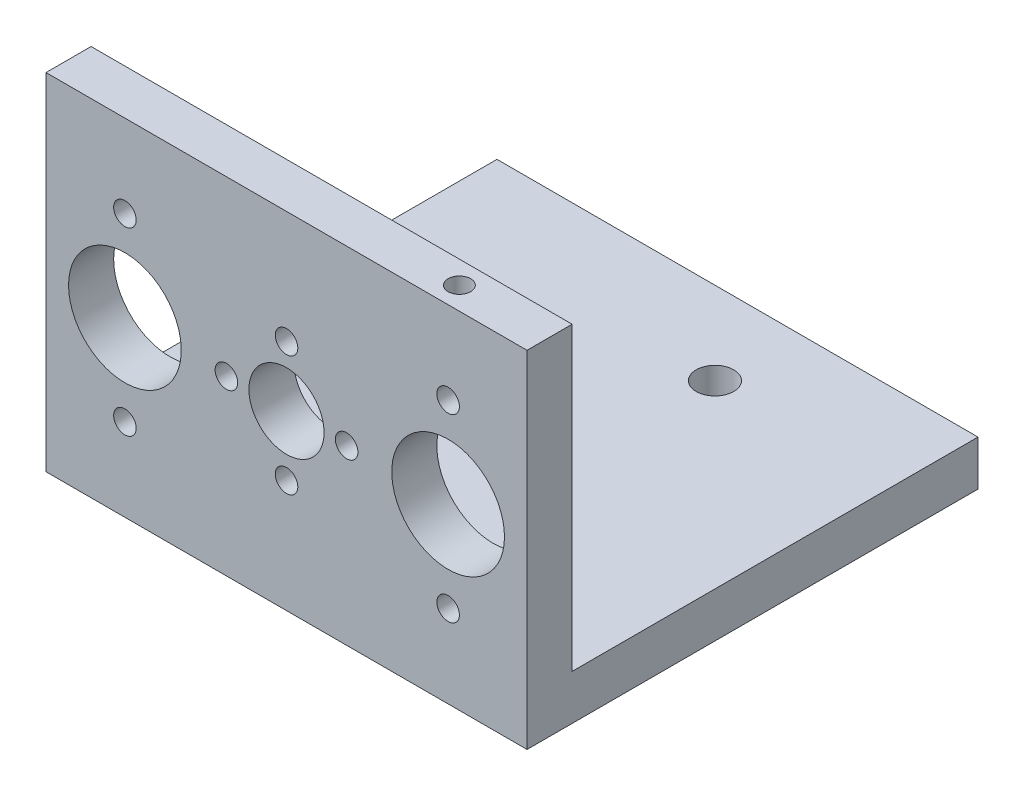
ISO-10303-21;
HEADER;
FILE_DESCRIPTION(('STEP AP214'),'2;1');
FILE_NAME('part.step','',(''),(''),'','','');
FILE_SCHEMA(('AUTOMOTIVE_DESIGN { 1 0 10303 214 1 1 1 1 }'));
ENDSEC;
DATA;
#1=APPLICATION_CONTEXT('core data for automotive mechanical design processes');
#2=APPLICATION_PROTOCOL_DEFINITION('international standard','automotive_design',2000,#1);
#3=PRODUCT_CONTEXT('',#1,'mechanical');
#4=PRODUCT('Part','Part','',(#3));
#5=PRODUCT_RELATED_PRODUCT_CATEGORY('part','',(#4));
#6=PRODUCT_DEFINITION_FORMATION('','',#4);
#7=PRODUCT_DEFINITION_CONTEXT('part definition',#1,'design');
#8=PRODUCT_DEFINITION('design','',#6,#7);
#9=PRODUCT_DEFINITION_SHAPE('','',#8);
#10=(LENGTH_UNIT() NAMED_UNIT(*) SI_UNIT(.MILLI.,.METRE.));
#11=(NAMED_UNIT(*) PLANE_ANGLE_UNIT() SI_UNIT($,.RADIAN.));
#12=(NAMED_UNIT(*) SI_UNIT($,.STERADIAN.) SOLID_ANGLE_UNIT());
#13=UNCERTAINTY_MEASURE_WITH_UNIT(LENGTH_MEASURE(1.E-05),#10,'distance_accuracy_value','');
#14=(GEOMETRIC_REPRESENTATION_CONTEXT(3) GLOBAL_UNCERTAINTY_ASSIGNED_CONTEXT((#13)) GLOBAL_UNIT_ASSIGNED_CONTEXT((#10,
#11,#12)) REPRESENTATION_CONTEXT('',''));
#15=CARTESIAN_POINT('',(0.,0.,0.));
#16=DIRECTION('',(0.,0.,1.));
#17=DIRECTION('',(1.,0.,0.));
#18=AXIS2_PLACEMENT_3D('',#15,#16,#17);
#19=CARTESIAN_POINT('',(104.,0.,0.));
#20=DIRECTION('',(0.,1.,0.));
#21=DIRECTION('',(0.,0.,1.));
#22=AXIS2_PLACEMENT_3D('',#19,#20,#21);
#23=PLANE('',#22);
#24=CARTESIAN_POINT('',(60.,0.,-49.));
#25=DIRECTION('',(0.,1.,0.));
#26=DIRECTION('',(0.,0.,1.));
#27=AXIS2_PLACEMENT_3D('',#24,#25,#26);
#28=CIRCLE('',#27,2.5);
#29=CARTESIAN_POINT('',(60.,0.,-46.5));
#30=VERTEX_POINT('',#29);
#31=EDGE_CURVE('E108',#30,#30,#28,.T.);
#32=ORIENTED_EDGE('',*,*,#31,.T.);
#33=EDGE_LOOP('',(#32));
#34=FACE_BOUND('',#33,.T.);
#35=CARTESIAN_POINT('',(60.,0.,-11.));
#36=DIRECTION('',(0.,1.,0.));
#37=DIRECTION('',(0.,0.,1.));
#38=AXIS2_PLACEMENT_3D('',#35,#36,#37);
#39=CIRCLE('',#38,2.49999999999999);
#40=CARTESIAN_POINT('',(60.,0.,-8.5));
#41=VERTEX_POINT('',#40);
#42=EDGE_CURVE('E116',#41,#41,#39,.T.);
#43=ORIENTED_EDGE('',*,*,#42,.T.);
#44=EDGE_LOOP('',(#43));
#45=FACE_BOUND('',#44,.T.);
#46=DIRECTION('',(-1.,0.,0.));
#47=VECTOR('',#46,1.);
#48=CARTESIAN_POINT('',(104.,0.,0.));
#49=LINE('',#48,#47);
#50=CARTESIAN_POINT('',(84.,0.,0.));
#51=VERTEX_POINT('',#50);
#52=CARTESIAN_POINT('',(20.,0.,0.));
#53=VERTEX_POINT('',#52);
#54=EDGE_CURVE('E11',#51,#53,#49,.T.);
#55=ORIENTED_EDGE('',*,*,#54,.T.);
#56=DIRECTION('',(0.,0.,-1.));
#57=VECTOR('',#56,1.);
#58=CARTESIAN_POINT('',(20.,0.,-6.));
#59=LINE('',#58,#57);
#60=CARTESIAN_POINT('',(20.,0.,-60.));
#61=VERTEX_POINT('',#60);
#62=EDGE_CURVE('E196',#53,#61,#59,.T.);
#63=ORIENTED_EDGE('',*,*,#62,.T.);
#64=DIRECTION('',(1.,0.,0.));
#65=VECTOR('',#64,1.);
#66=CARTESIAN_POINT('',(84.,0.,-60.));
#67=LINE('',#66,#65);
#68=CARTESIAN_POINT('',(84.,0.,-60.));
#69=VERTEX_POINT('',#68);
#70=EDGE_CURVE('E103',#61,#69,#67,.T.);
#71=ORIENTED_EDGE('',*,*,#70,.T.);
#72=DIRECTION('',(0.,0.,1.));
#73=VECTOR('',#72,1.);
#74=CARTESIAN_POINT('',(84.,0.,-6.));
#75=LINE('',#74,#73);
#76=EDGE_CURVE('E78',#69,#51,#75,.T.);
#77=ORIENTED_EDGE('',*,*,#76,.T.);
#78=EDGE_LOOP('',(#55,#63,#71,#77));
#79=FACE_BOUND('',#78,.T.);
#80=ADVANCED_FACE('F39',(#34,#45,#79),#23,.F.);
#81=CARTESIAN_POINT('',(104.,6.,-6.));
#82=DIRECTION('',(0.,-1.,0.));
#83=DIRECTION('',(0.,0.,-1.));
#84=AXIS2_PLACEMENT_3D('',#81,#82,#83);
#85=PLANE('',#84);
#86=CARTESIAN_POINT('',(60.,6.,-49.));
#87=DIRECTION('',(0.,1.,0.));
#88=DIRECTION('',(0.,0.,1.));
#89=AXIS2_PLACEMENT_3D('',#86,#87,#88);
#90=CIRCLE('',#89,2.5);
#91=CARTESIAN_POINT('',(60.,6.,-46.5));
#92=VERTEX_POINT('',#91);
#93=EDGE_CURVE('E81',#92,#92,#90,.T.);
#94=ORIENTED_EDGE('',*,*,#93,.F.);
#95=EDGE_LOOP('',(#94));
#96=FACE_BOUND('',#95,.T.);
#97=CARTESIAN_POINT('',(60.,6.,-11.));
#98=DIRECTION('',(0.,1.,0.));
#99=DIRECTION('',(0.,0.,1.));
#100=AXIS2_PLACEMENT_3D('',#97,#98,#99);
#101=CIRCLE('',#100,2.49999999999999);
#102=CARTESIAN_POINT('',(60.,6.,-8.5));
#103=VERTEX_POINT('',#102);
#104=EDGE_CURVE('E112',#103,#103,#101,.T.);
#105=ORIENTED_EDGE('',*,*,#104,.F.);
#106=EDGE_LOOP('',(#105));
#107=FACE_BOUND('',#106,.T.);
#108=DIRECTION('',(-1.,0.,0.));
#109=VECTOR('',#108,1.);
#110=CARTESIAN_POINT('',(104.,6.,-6.));
#111=LINE('',#110,#109);
#112=CARTESIAN_POINT('',(84.,6.,-6.));
#113=VERTEX_POINT('',#112);
#114=CARTESIAN_POINT('',(20.,6.,-6.));
#115=VERTEX_POINT('',#114);
#116=EDGE_CURVE('E48',#113,#115,#111,.T.);
#117=ORIENTED_EDGE('',*,*,#116,.F.);
#118=DIRECTION('',(0.,0.,1.));
#119=VECTOR('',#118,1.);
#120=CARTESIAN_POINT('',(84.,6.,-6.));
#121=LINE('',#120,#119);
#122=CARTESIAN_POINT('',(84.,6.,-60.));
#123=VERTEX_POINT('',#122);
#124=EDGE_CURVE('E74',#123,#113,#121,.T.);
#125=ORIENTED_EDGE('',*,*,#124,.F.);
#126=DIRECTION('',(1.,0.,0.));
#127=VECTOR('',#126,1.);
#128=CARTESIAN_POINT('',(84.,6.,-60.));
#129=LINE('',#128,#127);
#130=CARTESIAN_POINT('',(20.,6.,-60.));
#131=VERTEX_POINT('',#130);
#132=EDGE_CURVE('E84',#131,#123,#129,.T.);
#133=ORIENTED_EDGE('',*,*,#132,.F.);
#134=DIRECTION('',(0.,0.,-1.));
#135=VECTOR('',#134,1.);
#136=CARTESIAN_POINT('',(20.,6.,-6.));
#137=LINE('',#136,#135);
#138=EDGE_CURVE('E89',#115,#131,#137,.T.);
#139=ORIENTED_EDGE('',*,*,#138,.F.);
#140=EDGE_LOOP('',(#117,#125,#133,#139));
#141=FACE_BOUND('',#140,.T.);
#142=ADVANCED_FACE('F91',(#96,#107,#141),#85,.F.);
#143=CARTESIAN_POINT('',(104.,6.,-6.));
#144=DIRECTION('',(0.,0.,1.));
#145=DIRECTION('',(1.,0.,0.));
#146=AXIS2_PLACEMENT_3D('',#143,#144,#145);
#147=PLANE('',#146);
#148=CARTESIAN_POINT('',(44.,23.,-6.));
#149=DIRECTION('',(0.,0.,-1.));
#150=DIRECTION('',(-1.,0.,0.));
#151=AXIS2_PLACEMENT_3D('',#148,#149,#150);
#152=CIRCLE('',#151,1.5);
#153=CARTESIAN_POINT('',(42.5,23.,-6.));
#154=VERTEX_POINT('',#153);
#155=EDGE_CURVE('E144',#154,#154,#152,.T.);
#156=ORIENTED_EDGE('',*,*,#155,.F.);
#157=EDGE_LOOP('',(#156));
#158=FACE_BOUND('',#157,.T.);
#159=CARTESIAN_POINT('',(30.5,35.,-6.));
#160=DIRECTION('',(0.,0.,-1.));
#161=DIRECTION('',(-1.,0.,0.));
#162=AXIS2_PLACEMENT_3D('',#159,#160,#161);
#163=CIRCLE('',#162,1.5);
#164=CARTESIAN_POINT('',(29.,35.,-6.));
#165=VERTEX_POINT('',#164);
#166=EDGE_CURVE('E235',#165,#165,#163,.T.);
#167=ORIENTED_EDGE('',*,*,#166,.F.);
#168=EDGE_LOOP('',(#167));
#169=FACE_BOUND('',#168,.T.);
#170=CARTESIAN_POINT('',(30.5,11.,-6.));
#171=DIRECTION('',(0.,0.,-1.));
#172=DIRECTION('',(1.,0.,0.));
#173=AXIS2_PLACEMENT_3D('',#170,#171,#172);
#174=CIRCLE('',#173,1.5);
#175=CARTESIAN_POINT('',(32.,11.,-6.));
#176=VERTEX_POINT('',#175);
#177=EDGE_CURVE('E226',#176,#176,#174,.T.);
#178=ORIENTED_EDGE('',*,*,#177,.F.);
#179=EDGE_LOOP('',(#178));
#180=FACE_BOUND('',#179,.T.);
#181=CARTESIAN_POINT('',(52.,15.,-6.));
#182=DIRECTION('',(0.,0.,-1.));
#183=DIRECTION('',(-1.,0.,0.));
#184=AXIS2_PLACEMENT_3D('',#181,#182,#183);
#185=CIRCLE('',#184,1.5);
#186=CARTESIAN_POINT('',(50.5,15.,-6.));
#187=VERTEX_POINT('',#186);
#188=EDGE_CURVE('E181',#187,#187,#185,.T.);
#189=ORIENTED_EDGE('',*,*,#188,.F.);
#190=EDGE_LOOP('',(#189));
#191=FACE_BOUND('',#190,.T.);
#192=CARTESIAN_POINT('',(30.5,23.,-6.));
#193=DIRECTION('',(0.,0.,-1.));
#194=DIRECTION('',(-1.,0.,0.));
#195=AXIS2_PLACEMENT_3D('',#192,#193,#194);
#196=CIRCLE('',#195,7.5);
#197=CARTESIAN_POINT('',(23.,23.,-6.));
#198=VERTEX_POINT('',#197);
#199=EDGE_CURVE('E165',#198,#198,#196,.T.);
#200=ORIENTED_EDGE('',*,*,#199,.F.);
#201=EDGE_LOOP('',(#200));
#202=FACE_BOUND('',#201,.T.);
#203=CARTESIAN_POINT('',(60.,23.,-6.));
#204=DIRECTION('',(0.,0.,-1.));
#205=DIRECTION('',(-1.,0.,0.));
#206=AXIS2_PLACEMENT_3D('',#203,#204,#205);
#207=CIRCLE('',#206,1.5);
#208=CARTESIAN_POINT('',(58.5,23.,-6.));
#209=VERTEX_POINT('',#208);
#210=EDGE_CURVE('E166',#209,#209,#207,.T.);
#211=ORIENTED_EDGE('',*,*,#210,.F.);
#212=EDGE_LOOP('',(#211));
#213=FACE_BOUND('',#212,.T.);
#214=CARTESIAN_POINT('',(52.,31.,-6.));
#215=DIRECTION('',(0.,0.,-1.));
#216=DIRECTION('',(-1.,0.,0.));
#217=AXIS2_PLACEMENT_3D('',#214,#215,#216);
#218=CIRCLE('',#217,1.50000000000001);
#219=CARTESIAN_POINT('',(50.5,31.,-6.));
#220=VERTEX_POINT('',#219);
#221=EDGE_CURVE('E157',#220,#220,#218,.T.);
#222=ORIENTED_EDGE('',*,*,#221,.F.);
#223=EDGE_LOOP('',(#222));
#224=FACE_BOUND('',#223,.T.);
#225=CARTESIAN_POINT('',(73.5,11.,-6.));
#226=DIRECTION('',(0.,0.,-1.));
#227=DIRECTION('',(-1.,0.,0.));
#228=AXIS2_PLACEMENT_3D('',#225,#226,#227);
#229=CIRCLE('',#228,1.5);
#230=CARTESIAN_POINT('',(72.,11.,-6.));
#231=VERTEX_POINT('',#230);
#232=EDGE_CURVE('E259',#231,#231,#229,.T.);
#233=ORIENTED_EDGE('',*,*,#232,.F.);
#234=EDGE_LOOP('',(#233));
#235=FACE_BOUND('',#234,.T.);
#236=CARTESIAN_POINT('',(73.5,23.,-6.));
#237=DIRECTION('',(0.,0.,-1.));
#238=DIRECTION('',(1.,0.,0.));
#239=AXIS2_PLACEMENT_3D('',#236,#237,#238);
#240=CIRCLE('',#239,7.50000000000003);
#241=CARTESIAN_POINT('',(81.,23.,-6.));
#242=VERTEX_POINT('',#241);
#243=EDGE_CURVE('E251',#242,#242,#240,.T.);
#244=ORIENTED_EDGE('',*,*,#243,.F.);
#245=EDGE_LOOP('',(#244));
#246=FACE_BOUND('',#245,.T.);
#247=CARTESIAN_POINT('',(73.5,35.,-6.));
#248=DIRECTION('',(0.,0.,-1.));
#249=DIRECTION('',(1.,0.,0.));
#250=AXIS2_PLACEMENT_3D('',#247,#248,#249);
#251=CIRCLE('',#250,1.5);
#252=CARTESIAN_POINT('',(75.,35.,-6.));
#253=VERTEX_POINT('',#252);
#254=EDGE_CURVE('E242',#253,#253,#251,.T.);
#255=ORIENTED_EDGE('',*,*,#254,.F.);
#256=EDGE_LOOP('',(#255));
#257=FACE_BOUND('',#256,.T.);
#258=CARTESIAN_POINT('',(52.,23.,-6.));
#259=DIRECTION('',(0.,0.,-1.));
#260=DIRECTION('',(-1.,0.,0.));
#261=AXIS2_PLACEMENT_3D('',#258,#259,#260);
#262=CIRCLE('',#261,5.);
#263=CARTESIAN_POINT('',(47.,23.,-6.));
#264=VERTEX_POINT('',#263);
#265=EDGE_CURVE('E100',#264,#264,#262,.T.);
#266=ORIENTED_EDGE('',*,*,#265,.F.);
#267=EDGE_LOOP('',(#266));
#268=FACE_BOUND('',#267,.T.);
#269=ORIENTED_EDGE('',*,*,#116,.T.);
#270=DIRECTION('',(0.,-1.,0.));
#271=VECTOR('',#270,1.);
#272=CARTESIAN_POINT('',(20.,0.,-6.));
#273=LINE('',#272,#271);
#274=CARTESIAN_POINT('',(20.,46.,-6.));
#275=VERTEX_POINT('',#274);
#276=EDGE_CURVE('E129',#275,#115,#273,.T.);
#277=ORIENTED_EDGE('',*,*,#276,.F.);
#278=DIRECTION('',(-1.,0.,0.));
#279=VECTOR('',#278,1.);
#280=CARTESIAN_POINT('',(84.,46.,-6.));
#281=LINE('',#280,#279);
#282=CARTESIAN_POINT('',(84.,46.,-6.));
#283=VERTEX_POINT('',#282);
#284=EDGE_CURVE('E133',#283,#275,#281,.T.);
#285=ORIENTED_EDGE('',*,*,#284,.F.);
#286=DIRECTION('',(0.,1.,0.));
#287=VECTOR('',#286,1.);
#288=CARTESIAN_POINT('',(84.,0.,-6.));
#289=LINE('',#288,#287);
#290=EDGE_CURVE('E130',#113,#283,#289,.T.);
#291=ORIENTED_EDGE('',*,*,#290,.F.);
#292=EDGE_LOOP('',(#269,#277,#285,#291));
#293=FACE_BOUND('',#292,.T.);
#294=ADVANCED_FACE('F126',(#158,#169,#180,#191,#202,#213,#224,#235,#246,#257,#268,#293),#147,.F.);
#295=CARTESIAN_POINT('',(104.,6.,0.));
#296=DIRECTION('',(0.,0.,-1.));
#297=DIRECTION('',(-1.,0.,0.));
#298=AXIS2_PLACEMENT_3D('',#295,#296,#297);
#299=PLANE('',#298);
#300=CARTESIAN_POINT('',(44.,23.,0.));
#301=DIRECTION('',(0.,0.,-1.));
#302=DIRECTION('',(-1.,0.,0.));
#303=AXIS2_PLACEMENT_3D('',#300,#301,#302);
#304=CIRCLE('',#303,1.5);
#305=CARTESIAN_POINT('',(42.5,23.,0.));
#306=VERTEX_POINT('',#305);
#307=EDGE_CURVE('E138',#306,#306,#304,.T.);
#308=ORIENTED_EDGE('',*,*,#307,.T.);
#309=EDGE_LOOP('',(#308));
#310=FACE_BOUND('',#309,.T.);
#311=CARTESIAN_POINT('',(30.5,35.,0.));
#312=DIRECTION('',(0.,0.,-1.));
#313=DIRECTION('',(-1.,0.,0.));
#314=AXIS2_PLACEMENT_3D('',#311,#312,#313);
#315=CIRCLE('',#314,1.5);
#316=CARTESIAN_POINT('',(29.,35.,0.));
#317=VERTEX_POINT('',#316);
#318=EDGE_CURVE('E224',#317,#317,#315,.T.);
#319=ORIENTED_EDGE('',*,*,#318,.T.);
#320=EDGE_LOOP('',(#319));
#321=FACE_BOUND('',#320,.T.);
#322=CARTESIAN_POINT('',(30.5,11.,0.));
#323=DIRECTION('',(0.,0.,-1.));
#324=DIRECTION('',(1.,0.,0.));
#325=AXIS2_PLACEMENT_3D('',#322,#323,#324);
#326=CIRCLE('',#325,1.5);
#327=CARTESIAN_POINT('',(32.,11.,0.));
#328=VERTEX_POINT('',#327);
#329=EDGE_CURVE('E230',#328,#328,#326,.T.);
#330=ORIENTED_EDGE('',*,*,#329,.T.);
#331=EDGE_LOOP('',(#330));
#332=FACE_BOUND('',#331,.T.);
#333=CARTESIAN_POINT('',(52.,15.,0.));
#334=DIRECTION('',(0.,0.,-1.));
#335=DIRECTION('',(-1.,0.,0.));
#336=AXIS2_PLACEMENT_3D('',#333,#334,#335);
#337=CIRCLE('',#336,1.5);
#338=CARTESIAN_POINT('',(50.5,15.,0.));
#339=VERTEX_POINT('',#338);
#340=EDGE_CURVE('E177',#339,#339,#337,.T.);
#341=ORIENTED_EDGE('',*,*,#340,.T.);
#342=EDGE_LOOP('',(#341));
#343=FACE_BOUND('',#342,.T.);
#344=CARTESIAN_POINT('',(30.5,23.,0.));
#345=DIRECTION('',(0.,0.,-1.));
#346=DIRECTION('',(-1.,0.,0.));
#347=AXIS2_PLACEMENT_3D('',#344,#345,#346);
#348=CIRCLE('',#347,7.5);
#349=CARTESIAN_POINT('',(23.,23.,0.));
#350=VERTEX_POINT('',#349);
#351=EDGE_CURVE('E185',#350,#350,#348,.T.);
#352=ORIENTED_EDGE('',*,*,#351,.T.);
#353=EDGE_LOOP('',(#352));
#354=FACE_BOUND('',#353,.T.);
#355=CARTESIAN_POINT('',(60.,23.,0.));
#356=DIRECTION('',(0.,0.,-1.));
#357=DIRECTION('',(-1.,0.,0.));
#358=AXIS2_PLACEMENT_3D('',#355,#356,#357);
#359=CIRCLE('',#358,1.5);
#360=CARTESIAN_POINT('',(58.5,23.,0.));
#361=VERTEX_POINT('',#360);
#362=EDGE_CURVE('E161',#361,#361,#359,.T.);
#363=ORIENTED_EDGE('',*,*,#362,.T.);
#364=EDGE_LOOP('',(#363));
#365=FACE_BOUND('',#364,.T.);
#366=CARTESIAN_POINT('',(52.,31.,0.));
#367=DIRECTION('',(0.,0.,-1.));
#368=DIRECTION('',(-1.,0.,0.));
#369=AXIS2_PLACEMENT_3D('',#366,#367,#368);
#370=CIRCLE('',#369,1.50000000000001);
#371=CARTESIAN_POINT('',(50.5,31.,0.));
#372=VERTEX_POINT('',#371);
#373=EDGE_CURVE('E170',#372,#372,#370,.T.);
#374=ORIENTED_EDGE('',*,*,#373,.T.);
#375=EDGE_LOOP('',(#374));
#376=FACE_BOUND('',#375,.T.);
#377=CARTESIAN_POINT('',(73.5,11.,0.));
#378=DIRECTION('',(0.,0.,-1.));
#379=DIRECTION('',(-1.,0.,0.));
#380=AXIS2_PLACEMENT_3D('',#377,#378,#379);
#381=CIRCLE('',#380,1.5);
#382=CARTESIAN_POINT('',(72.,11.,0.));
#383=VERTEX_POINT('',#382);
#384=EDGE_CURVE('E231',#383,#383,#381,.T.);
#385=ORIENTED_EDGE('',*,*,#384,.T.);
#386=EDGE_LOOP('',(#385));
#387=FACE_BOUND('',#386,.T.);
#388=CARTESIAN_POINT('',(73.5,23.,0.));
#389=DIRECTION('',(0.,0.,-1.));
#390=DIRECTION('',(1.,0.,0.));
#391=AXIS2_PLACEMENT_3D('',#388,#389,#390);
#392=CIRCLE('',#391,7.50000000000003);
#393=CARTESIAN_POINT('',(81.,23.,0.));
#394=VERTEX_POINT('',#393);
#395=EDGE_CURVE('E255',#394,#394,#392,.T.);
#396=ORIENTED_EDGE('',*,*,#395,.T.);
#397=EDGE_LOOP('',(#396));
#398=FACE_BOUND('',#397,.T.);
#399=CARTESIAN_POINT('',(73.5,35.,0.));
#400=DIRECTION('',(0.,0.,-1.));
#401=DIRECTION('',(1.,0.,0.));
#402=AXIS2_PLACEMENT_3D('',#399,#400,#401);
#403=CIRCLE('',#402,1.5);
#404=CARTESIAN_POINT('',(75.,35.,0.));
#405=VERTEX_POINT('',#404);
#406=EDGE_CURVE('E246',#405,#405,#403,.T.);
#407=ORIENTED_EDGE('',*,*,#406,.T.);
#408=EDGE_LOOP('',(#407));
#409=FACE_BOUND('',#408,.T.);
#410=CARTESIAN_POINT('',(52.,23.,0.));
#411=DIRECTION('',(0.,0.,-1.));
#412=DIRECTION('',(-1.,0.,0.));
#413=AXIS2_PLACEMENT_3D('',#410,#411,#412);
#414=CIRCLE('',#413,5.);
#415=CARTESIAN_POINT('',(47.,23.,0.));
#416=VERTEX_POINT('',#415);
#417=EDGE_CURVE('E94',#416,#416,#414,.T.);
#418=ORIENTED_EDGE('',*,*,#417,.T.);
#419=EDGE_LOOP('',(#418));
#420=FACE_BOUND('',#419,.T.);
#421=DIRECTION('',(-1.,0.,0.));
#422=VECTOR('',#421,1.);
#423=CARTESIAN_POINT('',(84.,46.,0.));
#424=LINE('',#423,#422);
#425=CARTESIAN_POINT('',(84.,46.,0.));
#426=VERTEX_POINT('',#425);
#427=CARTESIAN_POINT('',(20.,46.,0.));
#428=VERTEX_POINT('',#427);
#429=EDGE_CURVE('E211',#426,#428,#424,.T.);
#430=ORIENTED_EDGE('',*,*,#429,.T.);
#431=DIRECTION('',(0.,-1.,0.));
#432=VECTOR('',#431,1.);
#433=CARTESIAN_POINT('',(20.,0.,0.));
#434=LINE('',#433,#432);
#435=EDGE_CURVE('E147',#428,#53,#434,.T.);
#436=ORIENTED_EDGE('',*,*,#435,.T.);
#437=ORIENTED_EDGE('',*,*,#54,.F.);
#438=DIRECTION('',(0.,1.,0.));
#439=VECTOR('',#438,1.);
#440=CARTESIAN_POINT('',(84.,0.,0.));
#441=LINE('',#440,#439);
#442=EDGE_CURVE('E152',#51,#426,#441,.T.);
#443=ORIENTED_EDGE('',*,*,#442,.T.);
#444=EDGE_LOOP('',(#430,#436,#437,#443));
#445=FACE_BOUND('',#444,.T.);
#446=ADVANCED_FACE('F214',(#310,#321,#332,#343,#354,#365,#376,#387,#398,#409,#420,#445),#299,.F.);
#447=CARTESIAN_POINT('',(84.,0.,-6.));
#448=DIRECTION('',(-1.,0.,0.));
#449=DIRECTION('',(0.,0.,1.));
#450=AXIS2_PLACEMENT_3D('',#447,#448,#449);
#451=PLANE('',#450);
#452=ORIENTED_EDGE('',*,*,#124,.T.);
#453=ORIENTED_EDGE('',*,*,#290,.T.);
#454=DIRECTION('',(0.,0.,-1.));
#455=VECTOR('',#454,1.);
#456=CARTESIAN_POINT('',(84.,46.,0.));
#457=LINE('',#456,#455);
#458=EDGE_CURVE('E158',#426,#283,#457,.T.);
#459=ORIENTED_EDGE('',*,*,#458,.F.);
#460=ORIENTED_EDGE('',*,*,#442,.F.);
#461=ORIENTED_EDGE('',*,*,#76,.F.);
#462=DIRECTION('',(0.,1.,0.));
#463=VECTOR('',#462,1.);
#464=CARTESIAN_POINT('',(84.,0.,-60.));
#465=LINE('',#464,#463);
#466=EDGE_CURVE('E56',#69,#123,#465,.T.);
#467=ORIENTED_EDGE('',*,*,#466,.T.);
#468=EDGE_LOOP('',(#452,#453,#459,#460,#461,#467));
#469=FACE_BOUND('',#468,.T.);
#470=ADVANCED_FACE('F71',(#469),#451,.F.);
#471=CARTESIAN_POINT('',(84.,0.,-60.));
#472=DIRECTION('',(0.,0.,1.));
#473=DIRECTION('',(1.,0.,0.));
#474=AXIS2_PLACEMENT_3D('',#471,#472,#473);
#475=PLANE('',#474);
#476=ORIENTED_EDGE('',*,*,#132,.T.);
#477=ORIENTED_EDGE('',*,*,#466,.F.);
#478=ORIENTED_EDGE('',*,*,#70,.F.);
#479=DIRECTION('',(0.,1.,0.));
#480=VECTOR('',#479,1.);
#481=CARTESIAN_POINT('',(20.,0.,-60.));
#482=LINE('',#481,#480);
#483=EDGE_CURVE('E67',#61,#131,#482,.T.);
#484=ORIENTED_EDGE('',*,*,#483,.T.);
#485=EDGE_LOOP('',(#476,#477,#478,#484));
#486=FACE_BOUND('',#485,.T.);
#487=ADVANCED_FACE('F85',(#486),#475,.F.);
#488=CARTESIAN_POINT('',(20.,0.,-6.));
#489=DIRECTION('',(1.,0.,0.));
#490=DIRECTION('',(0.,0.,-1.));
#491=AXIS2_PLACEMENT_3D('',#488,#489,#490);
#492=PLANE('',#491);
#493=ORIENTED_EDGE('',*,*,#138,.T.);
#494=ORIENTED_EDGE('',*,*,#483,.F.);
#495=ORIENTED_EDGE('',*,*,#62,.F.);
#496=ORIENTED_EDGE('',*,*,#435,.F.);
#497=DIRECTION('',(0.,0.,-1.));
#498=VECTOR('',#497,1.);
#499=CARTESIAN_POINT('',(20.,46.,0.));
#500=LINE('',#499,#498);
#501=EDGE_CURVE('E153',#428,#275,#500,.T.);
#502=ORIENTED_EDGE('',*,*,#501,.T.);
#503=ORIENTED_EDGE('',*,*,#276,.T.);
#504=EDGE_LOOP('',(#493,#494,#495,#496,#502,#503));
#505=FACE_BOUND('',#504,.T.);
#506=ADVANCED_FACE('F294',(#505),#492,.F.);
#507=CARTESIAN_POINT('',(60.,0.,-11.));
#508=DIRECTION('',(0.,1.,0.));
#509=DIRECTION('',(0.,0.,1.));
#510=AXIS2_PLACEMENT_3D('',#507,#508,#509);
#511=CYLINDRICAL_SURFACE('',#510,2.49999999999999);
#512=ORIENTED_EDGE('',*,*,#42,.F.);
#513=EDGE_LOOP('',(#512));
#514=FACE_BOUND('',#513,.T.);
#515=ORIENTED_EDGE('',*,*,#104,.T.);
#516=EDGE_LOOP('',(#515));
#517=FACE_BOUND('',#516,.T.);
#518=ADVANCED_FACE('F296',(#514,#517),#511,.F.);
#519=CARTESIAN_POINT('',(60.,0.,-49.));
#520=DIRECTION('',(0.,1.,0.));
#521=DIRECTION('',(0.,0.,1.));
#522=AXIS2_PLACEMENT_3D('',#519,#520,#521);
#523=CYLINDRICAL_SURFACE('',#522,2.5);
#524=ORIENTED_EDGE('',*,*,#31,.F.);
#525=EDGE_LOOP('',(#524));
#526=FACE_BOUND('',#525,.T.);
#527=ORIENTED_EDGE('',*,*,#93,.T.);
#528=EDGE_LOOP('',(#527));
#529=FACE_BOUND('',#528,.T.);
#530=ADVANCED_FACE('F287',(#526,#529),#523,.F.);
#531=CARTESIAN_POINT('',(84.,46.,0.));
#532=DIRECTION('',(0.,-1.,0.));
#533=DIRECTION('',(0.,0.,-1.));
#534=AXIS2_PLACEMENT_3D('',#531,#532,#533);
#535=PLANE('',#534);
#536=CARTESIAN_POINT('',(72.,46.,-3.));
#537=DIRECTION('',(0.,1.,0.));
#538=DIRECTION('',(0.,0.,1.));
#539=AXIS2_PLACEMENT_3D('',#536,#537,#538);
#540=CIRCLE('',#539,1.5);
#541=CARTESIAN_POINT('',(72.,46.,-1.5));
#542=VERTEX_POINT('',#541);
#543=EDGE_CURVE('E266',#542,#542,#540,.T.);
#544=ORIENTED_EDGE('',*,*,#543,.F.);
#545=EDGE_LOOP('',(#544));
#546=FACE_BOUND('',#545,.T.);
#547=ORIENTED_EDGE('',*,*,#284,.T.);
#548=ORIENTED_EDGE('',*,*,#501,.F.);
#549=ORIENTED_EDGE('',*,*,#429,.F.);
#550=ORIENTED_EDGE('',*,*,#458,.T.);
#551=EDGE_LOOP('',(#547,#548,#549,#550));
#552=FACE_BOUND('',#551,.T.);
#553=ADVANCED_FACE('F283',(#546,#552),#535,.F.);
#554=CARTESIAN_POINT('',(52.,23.,0.));
#555=DIRECTION('',(0.,0.,-1.));
#556=DIRECTION('',(-1.,0.,0.));
#557=AXIS2_PLACEMENT_3D('',#554,#555,#556);
#558=CYLINDRICAL_SURFACE('',#557,5.);
#559=ORIENTED_EDGE('',*,*,#417,.F.);
#560=EDGE_LOOP('',(#559));
#561=FACE_BOUND('',#560,.T.);
#562=ORIENTED_EDGE('',*,*,#265,.T.);
#563=EDGE_LOOP('',(#562));
#564=FACE_BOUND('',#563,.T.);
#565=ADVANCED_FACE('F286',(#561,#564),#558,.F.);
#566=CARTESIAN_POINT('',(73.5,35.,0.));
#567=DIRECTION('',(0.,0.,-1.));
#568=DIRECTION('',(-1.,0.,0.));
#569=AXIS2_PLACEMENT_3D('',#566,#567,#568);
#570=CYLINDRICAL_SURFACE('',#569,1.5);
#571=ORIENTED_EDGE('',*,*,#406,.F.);
#572=EDGE_LOOP('',(#571));
#573=FACE_BOUND('',#572,.T.);
#574=ORIENTED_EDGE('',*,*,#254,.T.);
#575=EDGE_LOOP('',(#574));
#576=FACE_BOUND('',#575,.T.);
#577=ADVANCED_FACE('F356',(#573,#576),#570,.F.);
#578=CARTESIAN_POINT('',(73.5,23.,0.));
#579=DIRECTION('',(0.,0.,-1.));
#580=DIRECTION('',(-1.,0.,0.));
#581=AXIS2_PLACEMENT_3D('',#578,#579,#580);
#582=CYLINDRICAL_SURFACE('',#581,7.50000000000003);
#583=ORIENTED_EDGE('',*,*,#395,.F.);
#584=EDGE_LOOP('',(#583));
#585=FACE_BOUND('',#584,.T.);
#586=ORIENTED_EDGE('',*,*,#243,.T.);
#587=EDGE_LOOP('',(#586));
#588=FACE_BOUND('',#587,.T.);
#589=ADVANCED_FACE('F362',(#585,#588),#582,.F.);
#590=CARTESIAN_POINT('',(73.5,11.,0.));
#591=DIRECTION('',(0.,0.,-1.));
#592=DIRECTION('',(-1.,0.,0.));
#593=AXIS2_PLACEMENT_3D('',#590,#591,#592);
#594=CYLINDRICAL_SURFACE('',#593,1.5);
#595=ORIENTED_EDGE('',*,*,#384,.F.);
#596=EDGE_LOOP('',(#595));
#597=FACE_BOUND('',#596,.T.);
#598=ORIENTED_EDGE('',*,*,#232,.T.);
#599=EDGE_LOOP('',(#598));
#600=FACE_BOUND('',#599,.T.);
#601=ADVANCED_FACE('F380',(#597,#600),#594,.F.);
#602=CARTESIAN_POINT('',(52.,31.,0.));
#603=DIRECTION('',(0.,0.,-1.));
#604=DIRECTION('',(-1.,0.,0.));
#605=AXIS2_PLACEMENT_3D('',#602,#603,#604);
#606=CYLINDRICAL_SURFACE('',#605,1.50000000000001);
#607=ORIENTED_EDGE('',*,*,#373,.F.);
#608=EDGE_LOOP('',(#607));
#609=FACE_BOUND('',#608,.T.);
#610=ORIENTED_EDGE('',*,*,#221,.T.);
#611=EDGE_LOOP('',(#610));
#612=FACE_BOUND('',#611,.T.);
#613=ADVANCED_FACE('F377',(#609,#612),#606,.F.);
#614=CARTESIAN_POINT('',(60.,23.,0.));
#615=DIRECTION('',(0.,0.,-1.));
#616=DIRECTION('',(-1.,0.,0.));
#617=AXIS2_PLACEMENT_3D('',#614,#615,#616);
#618=CYLINDRICAL_SURFACE('',#617,1.5);
#619=ORIENTED_EDGE('',*,*,#362,.F.);
#620=EDGE_LOOP('',(#619));
#621=FACE_BOUND('',#620,.T.);
#622=ORIENTED_EDGE('',*,*,#210,.T.);
#623=EDGE_LOOP('',(#622));
#624=FACE_BOUND('',#623,.T.);
#625=ADVANCED_FACE('F371',(#621,#624),#618,.F.);
#626=CARTESIAN_POINT('',(30.5,23.,0.));
#627=DIRECTION('',(0.,0.,-1.));
#628=DIRECTION('',(-1.,0.,0.));
#629=AXIS2_PLACEMENT_3D('',#626,#627,#628);
#630=CYLINDRICAL_SURFACE('',#629,7.5);
#631=ORIENTED_EDGE('',*,*,#351,.F.);
#632=EDGE_LOOP('',(#631));
#633=FACE_BOUND('',#632,.T.);
#634=ORIENTED_EDGE('',*,*,#199,.T.);
#635=EDGE_LOOP('',(#634));
#636=FACE_BOUND('',#635,.T.);
#637=ADVANCED_FACE('F367',(#633,#636),#630,.F.);
#638=CARTESIAN_POINT('',(52.,15.,0.));
#639=DIRECTION('',(0.,0.,-1.));
#640=DIRECTION('',(-1.,0.,0.));
#641=AXIS2_PLACEMENT_3D('',#638,#639,#640);
#642=CYLINDRICAL_SURFACE('',#641,1.5);
#643=ORIENTED_EDGE('',*,*,#340,.F.);
#644=EDGE_LOOP('',(#643));
#645=FACE_BOUND('',#644,.T.);
#646=ORIENTED_EDGE('',*,*,#188,.T.);
#647=EDGE_LOOP('',(#646));
#648=FACE_BOUND('',#647,.T.);
#649=ADVANCED_FACE('F370',(#645,#648),#642,.F.);
#650=CARTESIAN_POINT('',(30.5,11.,0.));
#651=DIRECTION('',(0.,0.,-1.));
#652=DIRECTION('',(-1.,0.,0.));
#653=AXIS2_PLACEMENT_3D('',#650,#651,#652);
#654=CYLINDRICAL_SURFACE('',#653,1.5);
#655=ORIENTED_EDGE('',*,*,#329,.F.);
#656=EDGE_LOOP('',(#655));
#657=FACE_BOUND('',#656,.T.);
#658=ORIENTED_EDGE('',*,*,#177,.T.);
#659=EDGE_LOOP('',(#658));
#660=FACE_BOUND('',#659,.T.);
#661=ADVANCED_FACE('F375',(#657,#660),#654,.F.);
#662=CARTESIAN_POINT('',(30.5,35.,0.));
#663=DIRECTION('',(0.,0.,-1.));
#664=DIRECTION('',(-1.,0.,0.));
#665=AXIS2_PLACEMENT_3D('',#662,#663,#664);
#666=CYLINDRICAL_SURFACE('',#665,1.5);
#667=ORIENTED_EDGE('',*,*,#318,.F.);
#668=EDGE_LOOP('',(#667));
#669=FACE_BOUND('',#668,.T.);
#670=ORIENTED_EDGE('',*,*,#166,.T.);
#671=EDGE_LOOP('',(#670));
#672=FACE_BOUND('',#671,.T.);
#673=ADVANCED_FACE('F387',(#669,#672),#666,.F.);
#674=CARTESIAN_POINT('',(44.,23.,0.));
#675=DIRECTION('',(0.,0.,-1.));
#676=DIRECTION('',(-1.,0.,0.));
#677=AXIS2_PLACEMENT_3D('',#674,#675,#676);
#678=CYLINDRICAL_SURFACE('',#677,1.5);
#679=ORIENTED_EDGE('',*,*,#307,.F.);
#680=EDGE_LOOP('',(#679));
#681=FACE_BOUND('',#680,.T.);
#682=ORIENTED_EDGE('',*,*,#155,.T.);
#683=EDGE_LOOP('',(#682));
#684=FACE_BOUND('',#683,.T.);
#685=ADVANCED_FACE('F279',(#681,#684),#678,.F.);
#686=CARTESIAN_POINT('',(72.,41.,-3.));
#687=DIRECTION('',(0.,1.,0.));
#688=DIRECTION('',(0.,0.,1.));
#689=AXIS2_PLACEMENT_3D('',#686,#687,#688);
#690=CYLINDRICAL_SURFACE('',#689,1.5);
#691=CARTESIAN_POINT('',(72.,41.,-3.));
#692=DIRECTION('',(0.,1.,0.));
#693=DIRECTION('',(0.,0.,1.));
#694=AXIS2_PLACEMENT_3D('',#691,#692,#693);
#695=CIRCLE('',#694,1.5);
#696=CARTESIAN_POINT('',(72.,41.,-1.5));
#697=VERTEX_POINT('',#696);
#698=EDGE_CURVE('E247',#697,#697,#695,.T.);
#699=ORIENTED_EDGE('',*,*,#698,.F.);
#700=EDGE_LOOP('',(#699));
#701=FACE_BOUND('',#700,.T.);
#702=ORIENTED_EDGE('',*,*,#543,.T.);
#703=EDGE_LOOP('',(#702));
#704=FACE_BOUND('',#703,.T.);
#705=ADVANCED_FACE('F276',(#701,#704),#690,.F.);
#706=CARTESIAN_POINT('',(72.,41.,-3.));
#707=DIRECTION('',(0.,1.,0.));
#708=DIRECTION('',(0.,0.,1.));
#709=AXIS2_PLACEMENT_3D('',#706,#707,#708);
#710=PLANE('',#709);
#711=ORIENTED_EDGE('',*,*,#698,.T.);
#712=EDGE_LOOP('',(#711));
#713=FACE_BOUND('',#712,.T.);
#714=ADVANCED_FACE('F274',(#713),#710,.T.);
#715=CLOSED_SHELL('',(#80,#142,#294,#446,#470,#487,#506,#518,#530,#553,#565,#577,#589,#601,#613,
#625,#637,#649,#661,#673,#685,#705,#714));
#716=MANIFOLD_SOLID_BREP('B2',#715);
#717=ADVANCED_BREP_SHAPE_REPRESENTATION('',(#18,#716),#14);
#718=SHAPE_DEFINITION_REPRESENTATION(#9,#717);
ENDSEC;
END-ISO-10303-21;
